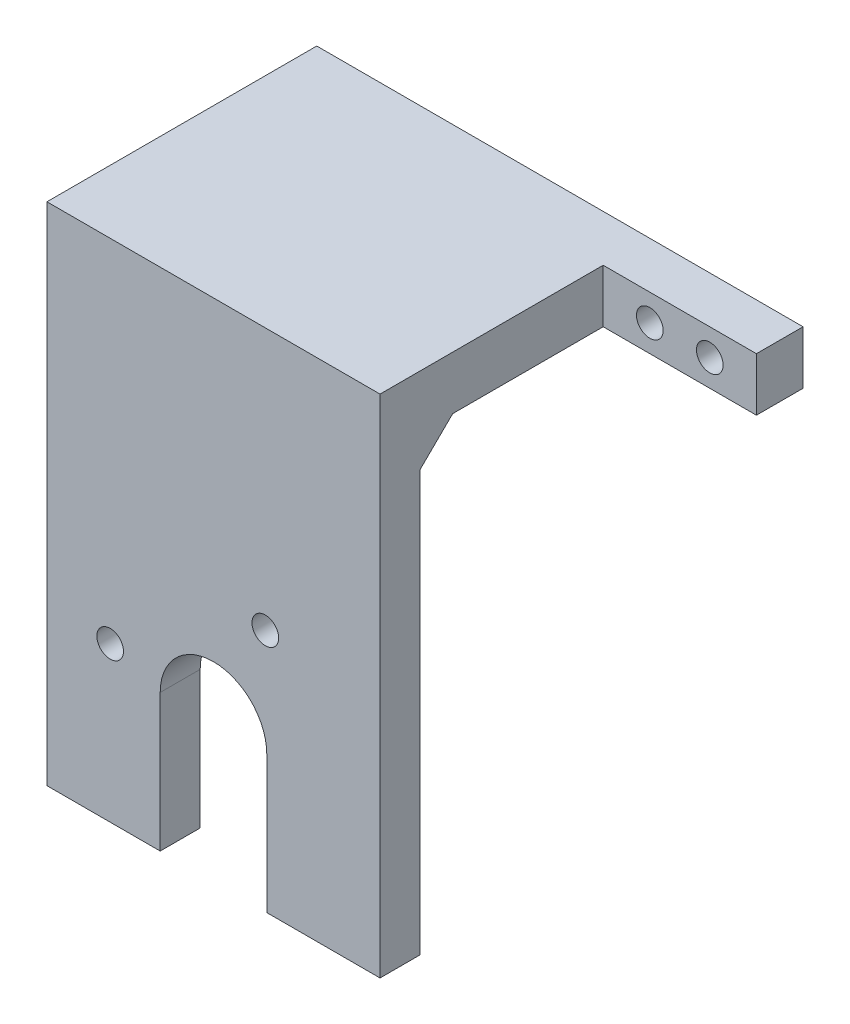
ISO-10303-21;
HEADER;
FILE_DESCRIPTION(('STEP AP214'),'2;1');
FILE_NAME('part.step','',(''),(''),'','','');
FILE_SCHEMA(('AUTOMOTIVE_DESIGN { 1 0 10303 214 1 1 1 1 }'));
ENDSEC;
DATA;
#1=APPLICATION_CONTEXT('core data for automotive mechanical design processes');
#2=APPLICATION_PROTOCOL_DEFINITION('international standard','automotive_design',2000,#1);
#3=PRODUCT_CONTEXT('',#1,'mechanical');
#4=PRODUCT('Part','Part','',(#3));
#5=PRODUCT_RELATED_PRODUCT_CATEGORY('part','',(#4));
#6=PRODUCT_DEFINITION_FORMATION('','',#4);
#7=PRODUCT_DEFINITION_CONTEXT('part definition',#1,'design');
#8=PRODUCT_DEFINITION('design','',#6,#7);
#9=PRODUCT_DEFINITION_SHAPE('','',#8);
#10=(LENGTH_UNIT() NAMED_UNIT(*) SI_UNIT(.MILLI.,.METRE.));
#11=(NAMED_UNIT(*) PLANE_ANGLE_UNIT() SI_UNIT($,.RADIAN.));
#12=(NAMED_UNIT(*) SI_UNIT($,.STERADIAN.) SOLID_ANGLE_UNIT());
#13=UNCERTAINTY_MEASURE_WITH_UNIT(LENGTH_MEASURE(1.E-05),#10,'distance_accuracy_value','');
#14=(GEOMETRIC_REPRESENTATION_CONTEXT(3) GLOBAL_UNCERTAINTY_ASSIGNED_CONTEXT((#13)) GLOBAL_UNIT_ASSIGNED_CONTEXT((#10,
#11,#12)) REPRESENTATION_CONTEXT('',''));
#15=CARTESIAN_POINT('',(0.,0.,0.));
#16=DIRECTION('',(0.,0.,1.));
#17=DIRECTION('',(1.,0.,0.));
#18=AXIS2_PLACEMENT_3D('',#15,#16,#17);
#19=CARTESIAN_POINT('',(0.,-64.9544915254237,0.));
#20=DIRECTION('',(0.,-1.,0.));
#21=DIRECTION('',(0.,0.,-1.));
#22=AXIS2_PLACEMENT_3D('',#19,#20,#21);
#23=PLANE('',#22);
#24=DIRECTION('',(0.,0.,1.));
#25=VECTOR('',#24,1.);
#26=CARTESIAN_POINT('',(-4.39406779661014,-64.9544915254237,5.5));
#27=LINE('',#26,#25);
#28=CARTESIAN_POINT('',(-4.39406779661014,-64.9544915254237,34.5));
#29=VERTEX_POINT('',#28);
#30=CARTESIAN_POINT('',(-4.39406779661014,-64.9544915254237,40.5));
#31=VERTEX_POINT('',#30);
#32=EDGE_CURVE('E41',#29,#31,#27,.T.);
#33=ORIENTED_EDGE('',*,*,#32,.F.);
#34=DIRECTION('',(1.,0.,0.));
#35=VECTOR('',#34,1.);
#36=CARTESIAN_POINT('',(-37.3940677966102,-64.9544915254237,34.5));
#37=LINE('',#36,#35);
#38=CARTESIAN_POINT('',(12.6059322033898,-64.9544915254237,34.5));
#39=VERTEX_POINT('',#38);
#40=EDGE_CURVE('E246',#29,#39,#37,.T.);
#41=ORIENTED_EDGE('',*,*,#40,.T.);
#42=DIRECTION('',(0.,0.,1.));
#43=VECTOR('',#42,1.);
#44=CARTESIAN_POINT('',(12.6059322033898,-64.9544915254237,40.5));
#45=LINE('',#44,#43);
#46=CARTESIAN_POINT('',(12.6059322033898,-64.9544915254237,40.5));
#47=VERTEX_POINT('',#46);
#48=EDGE_CURVE('E196',#39,#47,#45,.T.);
#49=ORIENTED_EDGE('',*,*,#48,.T.);
#50=DIRECTION('',(-1.,0.,0.));
#51=VECTOR('',#50,1.);
#52=CARTESIAN_POINT('',(-37.3940677966102,-64.9544915254237,40.5));
#53=LINE('',#52,#51);
#54=EDGE_CURVE('E187',#47,#31,#53,.T.);
#55=ORIENTED_EDGE('',*,*,#54,.T.);
#56=EDGE_LOOP('',(#33,#41,#49,#55));
#57=FACE_BOUND('',#56,.T.);
#58=ADVANCED_FACE('F33',(#57),#23,.T.);
#59=CARTESIAN_POINT('',(-37.3940677966102,2.95550847457627,40.5));
#60=DIRECTION('',(0.,1.,0.));
#61=DIRECTION('',(0.,0.,1.));
#62=AXIS2_PLACEMENT_3D('',#59,#60,#61);
#63=PLANE('',#62);
#64=DIRECTION('',(0.,0.,-1.));
#65=VECTOR('',#64,1.);
#66=CARTESIAN_POINT('',(-37.3940677966102,2.95550847457627,40.5));
#67=LINE('',#66,#65);
#68=CARTESIAN_POINT('',(-37.3940677966102,2.95550847457627,29.5872604999943));
#69=VERTEX_POINT('',#68);
#70=CARTESIAN_POINT('',(-37.3940677966102,2.95550847457627,0.));
#71=VERTEX_POINT('',#70);
#72=EDGE_CURVE('E124',#69,#71,#67,.T.);
#73=ORIENTED_EDGE('',*,*,#72,.T.);
#74=DIRECTION('',(-1.,0.,0.));
#75=VECTOR('',#74,1.);
#76=CARTESIAN_POINT('',(35.6059322033898,2.95550847457626,0.));
#77=LINE('',#76,#75);
#78=CARTESIAN_POINT('',(35.6059322033898,2.95550847457626,0.));
#79=VERTEX_POINT('',#78);
#80=EDGE_CURVE('E128',#79,#71,#77,.T.);
#81=ORIENTED_EDGE('',*,*,#80,.F.);
#82=DIRECTION('',(0.,0.,-1.));
#83=VECTOR('',#82,1.);
#84=CARTESIAN_POINT('',(35.6059322033898,2.95550847457626,7.));
#85=LINE('',#84,#83);
#86=CARTESIAN_POINT('',(35.6059322033898,2.95550847457626,7.));
#87=VERTEX_POINT('',#86);
#88=EDGE_CURVE('E223',#87,#79,#85,.T.);
#89=ORIENTED_EDGE('',*,*,#88,.F.);
#90=DIRECTION('',(-1.,0.,0.));
#91=VECTOR('',#90,1.);
#92=CARTESIAN_POINT('',(35.6059322033898,2.95550847457626,7.));
#93=LINE('',#92,#91);
#94=CARTESIAN_POINT('',(12.6059322033898,2.95550847457627,7.));
#95=VERTEX_POINT('',#94);
#96=EDGE_CURVE('E146',#87,#95,#93,.T.);
#97=ORIENTED_EDGE('',*,*,#96,.T.);
#98=DIRECTION('',(0.,0.,-1.));
#99=VECTOR('',#98,1.);
#100=CARTESIAN_POINT('',(12.6059322033898,2.95550847457627,40.5));
#101=LINE('',#100,#99);
#102=CARTESIAN_POINT('',(12.6059322033898,2.95550847457627,29.5872604999943));
#103=VERTEX_POINT('',#102);
#104=EDGE_CURVE('E53',#103,#95,#101,.T.);
#105=ORIENTED_EDGE('',*,*,#104,.F.);
#106=DIRECTION('',(-1.,0.,0.));
#107=VECTOR('',#106,1.);
#108=CARTESIAN_POINT('',(12.6059322033899,2.95550847457625,29.5872604999943));
#109=LINE('',#108,#107);
#110=EDGE_CURVE('E48',#103,#69,#109,.T.);
#111=ORIENTED_EDGE('',*,*,#110,.T.);
#112=EDGE_LOOP('',(#73,#81,#89,#97,#105,#111));
#113=FACE_BOUND('',#112,.T.);
#114=ADVANCED_FACE('F126',(#113),#63,.F.);
#115=CARTESIAN_POINT('',(-37.3940677966102,10.9555084745763,7.));
#116=DIRECTION('',(1.,0.,0.));
#117=DIRECTION('',(0.,1.,0.));
#118=AXIS2_PLACEMENT_3D('',#115,#116,#117);
#119=PLANE('',#118);
#120=ORIENTED_EDGE('',*,*,#72,.F.);
#121=DIRECTION('',(0.,-0.701002759097658,0.713158560025378));
#122=VECTOR('',#121,1.);
#123=CARTESIAN_POINT('',(-37.3940677966102,-1.87349328922436,34.5));
#124=LINE('',#123,#122);
#125=CARTESIAN_POINT('',(-37.3940677966102,-1.87349328922436,34.5));
#126=VERTEX_POINT('',#125);
#127=EDGE_CURVE('E141',#69,#126,#124,.T.);
#128=ORIENTED_EDGE('',*,*,#127,.T.);
#129=DIRECTION('',(0.,1.,0.));
#130=VECTOR('',#129,1.);
#131=CARTESIAN_POINT('',(-37.3940677966102,-64.9544915254237,34.5));
#132=LINE('',#131,#130);
#133=CARTESIAN_POINT('',(-37.3940677966102,-64.9544915254237,34.5));
#134=VERTEX_POINT('',#133);
#135=EDGE_CURVE('E201',#134,#126,#132,.T.);
#136=ORIENTED_EDGE('',*,*,#135,.F.);
#137=DIRECTION('',(0.,0.,-1.));
#138=VECTOR('',#137,1.);
#139=CARTESIAN_POINT('',(-37.3940677966102,-64.9544915254237,40.5));
#140=LINE('',#139,#138);
#141=CARTESIAN_POINT('',(-37.3940677966102,-64.9544915254237,40.5));
#142=VERTEX_POINT('',#141);
#143=EDGE_CURVE('E243',#142,#134,#140,.T.);
#144=ORIENTED_EDGE('',*,*,#143,.F.);
#145=DIRECTION('',(0.,-1.,0.));
#146=VECTOR('',#145,1.);
#147=CARTESIAN_POINT('',(-37.3940677966102,10.9555084745763,40.5));
#148=LINE('',#147,#146);
#149=CARTESIAN_POINT('',(-37.3940677966102,10.9555084745763,40.5));
#150=VERTEX_POINT('',#149);
#151=EDGE_CURVE('E149',#150,#142,#148,.T.);
#152=ORIENTED_EDGE('',*,*,#151,.F.);
#153=DIRECTION('',(0.,0.,-1.));
#154=VECTOR('',#153,1.);
#155=CARTESIAN_POINT('',(-37.3940677966102,10.9555084745763,7.));
#156=LINE('',#155,#154);
#157=CARTESIAN_POINT('',(-37.3940677966102,10.9555084745763,0.));
#158=VERTEX_POINT('',#157);
#159=EDGE_CURVE('E138',#150,#158,#156,.T.);
#160=ORIENTED_EDGE('',*,*,#159,.T.);
#161=DIRECTION('',(0.,1.,0.));
#162=VECTOR('',#161,1.);
#163=CARTESIAN_POINT('',(-37.3940677966102,0.,0.));
#164=LINE('',#163,#162);
#165=EDGE_CURVE('E136',#71,#158,#164,.T.);
#166=ORIENTED_EDGE('',*,*,#165,.F.);
#167=EDGE_LOOP('',(#120,#128,#136,#144,#152,#160,#166));
#168=FACE_BOUND('',#167,.T.);
#169=ADVANCED_FACE('F35',(#168),#119,.F.);
#170=CARTESIAN_POINT('',(12.6059322033898,10.9555084745763,7.));
#171=DIRECTION('',(-1.,0.,0.));
#172=DIRECTION('',(0.,-1.,0.));
#173=AXIS2_PLACEMENT_3D('',#170,#171,#172);
#174=PLANE('',#173);
#175=DIRECTION('',(0.,-0.701002759097658,0.713158560025378));
#176=VECTOR('',#175,1.);
#177=CARTESIAN_POINT('',(12.6059322033899,-1.87349328922438,34.5));
#178=LINE('',#177,#176);
#179=CARTESIAN_POINT('',(12.6059322033898,-1.87349328922437,34.5));
#180=VERTEX_POINT('',#179);
#181=EDGE_CURVE('E280',#103,#180,#178,.T.);
#182=ORIENTED_EDGE('',*,*,#181,.F.);
#183=ORIENTED_EDGE('',*,*,#104,.T.);
#184=DIRECTION('',(0.,-1.,0.));
#185=VECTOR('',#184,1.);
#186=CARTESIAN_POINT('',(12.6059322033898,2.95550847457627,7.));
#187=LINE('',#186,#185);
#188=CARTESIAN_POINT('',(12.6059322033898,10.9555084745763,7.));
#189=VERTEX_POINT('',#188);
#190=EDGE_CURVE('E219',#189,#95,#187,.T.);
#191=ORIENTED_EDGE('',*,*,#190,.F.);
#192=DIRECTION('',(0.,0.,-1.));
#193=VECTOR('',#192,1.);
#194=CARTESIAN_POINT('',(12.6059322033898,10.9555084745763,7.));
#195=LINE('',#194,#193);
#196=CARTESIAN_POINT('',(12.6059322033898,10.9555084745763,40.5));
#197=VERTEX_POINT('',#196);
#198=EDGE_CURVE('E167',#197,#189,#195,.T.);
#199=ORIENTED_EDGE('',*,*,#198,.F.);
#200=DIRECTION('',(0.,1.,0.));
#201=VECTOR('',#200,1.);
#202=CARTESIAN_POINT('',(12.6059322033898,10.9555084745763,40.5));
#203=LINE('',#202,#201);
#204=EDGE_CURVE('E158',#47,#197,#203,.T.);
#205=ORIENTED_EDGE('',*,*,#204,.F.);
#206=ORIENTED_EDGE('',*,*,#48,.F.);
#207=DIRECTION('',(0.,1.,0.));
#208=VECTOR('',#207,1.);
#209=CARTESIAN_POINT('',(12.6059322033898,-64.9544915254237,34.5));
#210=LINE('',#209,#208);
#211=EDGE_CURVE('E197',#39,#180,#210,.T.);
#212=ORIENTED_EDGE('',*,*,#211,.T.);
#213=EDGE_LOOP('',(#182,#183,#191,#199,#205,#206,#212));
#214=FACE_BOUND('',#213,.T.);
#215=ADVANCED_FACE('F234',(#214),#174,.F.);
#216=CARTESIAN_POINT('',(-37.3940677966102,10.9555084745763,7.));
#217=DIRECTION('',(0.,-1.,0.));
#218=DIRECTION('',(0.,0.,-1.));
#219=AXIS2_PLACEMENT_3D('',#216,#217,#218);
#220=PLANE('',#219);
#221=DIRECTION('',(-1.,0.,0.));
#222=VECTOR('',#221,1.);
#223=CARTESIAN_POINT('',(-37.3940677966102,10.9555084745763,0.));
#224=LINE('',#223,#222);
#225=CARTESIAN_POINT('',(35.6059322033898,10.9555084745763,0.));
#226=VERTEX_POINT('',#225);
#227=EDGE_CURVE('E133',#226,#158,#224,.T.);
#228=ORIENTED_EDGE('',*,*,#227,.T.);
#229=ORIENTED_EDGE('',*,*,#159,.F.);
#230=DIRECTION('',(-1.,0.,0.));
#231=VECTOR('',#230,1.);
#232=CARTESIAN_POINT('',(-37.3940677966102,10.9555084745763,40.5));
#233=LINE('',#232,#231);
#234=EDGE_CURVE('E161',#197,#150,#233,.T.);
#235=ORIENTED_EDGE('',*,*,#234,.F.);
#236=ORIENTED_EDGE('',*,*,#198,.T.);
#237=DIRECTION('',(-1.,0.,0.));
#238=VECTOR('',#237,1.);
#239=CARTESIAN_POINT('',(35.6059322033898,10.9555084745763,7.));
#240=LINE('',#239,#238);
#241=CARTESIAN_POINT('',(35.6059322033898,10.9555084745763,7.));
#242=VERTEX_POINT('',#241);
#243=EDGE_CURVE('E147',#242,#189,#240,.T.);
#244=ORIENTED_EDGE('',*,*,#243,.F.);
#245=DIRECTION('',(0.,0.,1.));
#246=VECTOR('',#245,1.);
#247=CARTESIAN_POINT('',(35.6059322033898,10.9555084745763,7.));
#248=LINE('',#247,#246);
#249=EDGE_CURVE('E152',#226,#242,#248,.T.);
#250=ORIENTED_EDGE('',*,*,#249,.F.);
#251=EDGE_LOOP('',(#228,#229,#235,#236,#244,#250));
#252=FACE_BOUND('',#251,.T.);
#253=ADVANCED_FACE('F237',(#252),#220,.F.);
#254=CARTESIAN_POINT('',(0.,0.,0.));
#255=DIRECTION('',(0.,0.,1.));
#256=DIRECTION('',(1.,0.,0.));
#257=AXIS2_PLACEMENT_3D('',#254,#255,#256);
#258=PLANE('',#257);
#259=CARTESIAN_POINT('',(19.6059322033898,6.95550847457627,0.));
#260=DIRECTION('',(0.,0.,1.));
#261=DIRECTION('',(1.,0.,0.));
#262=AXIS2_PLACEMENT_3D('',#259,#260,#261);
#263=CIRCLE('',#262,2.);
#264=CARTESIAN_POINT('',(21.6059322033898,6.95550847457627,0.));
#265=VERTEX_POINT('',#264);
#266=EDGE_CURVE('E216',#265,#265,#263,.T.);
#267=ORIENTED_EDGE('',*,*,#266,.T.);
#268=EDGE_LOOP('',(#267));
#269=FACE_BOUND('',#268,.T.);
#270=CARTESIAN_POINT('',(28.6059322033898,6.95550847457626,0.));
#271=DIRECTION('',(0.,0.,1.));
#272=DIRECTION('',(1.,0.,0.));
#273=AXIS2_PLACEMENT_3D('',#270,#271,#272);
#274=CIRCLE('',#273,2.);
#275=CARTESIAN_POINT('',(30.6059322033898,6.95550847457626,0.));
#276=VERTEX_POINT('',#275);
#277=EDGE_CURVE('E211',#276,#276,#274,.T.);
#278=ORIENTED_EDGE('',*,*,#277,.T.);
#279=EDGE_LOOP('',(#278));
#280=FACE_BOUND('',#279,.T.);
#281=ORIENTED_EDGE('',*,*,#80,.T.);
#282=ORIENTED_EDGE('',*,*,#165,.T.);
#283=ORIENTED_EDGE('',*,*,#227,.F.);
#284=DIRECTION('',(0.,1.,0.));
#285=VECTOR('',#284,1.);
#286=CARTESIAN_POINT('',(35.6059322033898,2.95550847457626,0.));
#287=LINE('',#286,#285);
#288=EDGE_CURVE('E145',#79,#226,#287,.T.);
#289=ORIENTED_EDGE('',*,*,#288,.F.);
#290=EDGE_LOOP('',(#281,#282,#283,#289));
#291=FACE_BOUND('',#290,.T.);
#292=ADVANCED_FACE('F143',(#269,#280,#291),#258,.F.);
#293=CARTESIAN_POINT('',(0.,0.,40.5));
#294=DIRECTION('',(0.,0.,1.));
#295=DIRECTION('',(1.,0.,0.));
#296=AXIS2_PLACEMENT_3D('',#293,#294,#295);
#297=PLANE('',#296);
#298=CARTESIAN_POINT('',(-27.9010287653283,-41.7569338906564,40.5));
#299=DIRECTION('',(0.,0.,1.));
#300=DIRECTION('',(1.,0.,0.));
#301=AXIS2_PLACEMENT_3D('',#298,#299,#300);
#302=CIRCLE('',#301,2.);
#303=CARTESIAN_POINT('',(-25.9010287653283,-41.7569338906564,40.5));
#304=VERTEX_POINT('',#303);
#305=EDGE_CURVE('E266',#304,#304,#302,.T.);
#306=ORIENTED_EDGE('',*,*,#305,.F.);
#307=EDGE_LOOP('',(#306));
#308=FACE_BOUND('',#307,.T.);
#309=CARTESIAN_POINT('',(-4.61668756949044,-28.3707157826755,40.5));
#310=DIRECTION('',(0.,0.,1.));
#311=DIRECTION('',(1.,0.,0.));
#312=AXIS2_PLACEMENT_3D('',#309,#310,#311);
#313=CIRCLE('',#312,2.);
#314=CARTESIAN_POINT('',(-2.61668756949044,-28.3707157826755,40.5));
#315=VERTEX_POINT('',#314);
#316=EDGE_CURVE('E269',#315,#315,#313,.T.);
#317=ORIENTED_EDGE('',*,*,#316,.F.);
#318=EDGE_LOOP('',(#317));
#319=FACE_BOUND('',#318,.T.);
#320=DIRECTION('',(0.,1.,0.));
#321=VECTOR('',#320,1.);
#322=CARTESIAN_POINT('',(-4.39406779661014,-44.3311558299553,40.5));
#323=LINE('',#322,#321);
#324=CARTESIAN_POINT('',(-4.39406779661014,-44.3311558299553,40.5));
#325=VERTEX_POINT('',#324);
#326=EDGE_CURVE('E177',#31,#325,#323,.T.);
#327=ORIENTED_EDGE('',*,*,#326,.F.);
#328=ORIENTED_EDGE('',*,*,#54,.F.);
#329=ORIENTED_EDGE('',*,*,#204,.T.);
#330=ORIENTED_EDGE('',*,*,#234,.T.);
#331=ORIENTED_EDGE('',*,*,#151,.T.);
#332=CARTESIAN_POINT('',(-20.3940677966102,-64.9544915254237,40.5));
#333=VERTEX_POINT('',#332);
#334=EDGE_CURVE('E198',#333,#142,#53,.T.);
#335=ORIENTED_EDGE('',*,*,#334,.F.);
#336=DIRECTION('',(0.,-1.,0.));
#337=VECTOR('',#336,1.);
#338=CARTESIAN_POINT('',(-20.3940677966101,-44.3311558299553,40.5));
#339=LINE('',#338,#337);
#340=CARTESIAN_POINT('',(-20.3940677966101,-44.3311558299553,40.5));
#341=VERTEX_POINT('',#340);
#342=EDGE_CURVE('E192',#341,#333,#339,.T.);
#343=ORIENTED_EDGE('',*,*,#342,.F.);
#344=CARTESIAN_POINT('',(-12.3940677966101,-44.3311558299553,40.5));
#345=DIRECTION('',(0.,0.,1.));
#346=DIRECTION('',(1.,0.,0.));
#347=AXIS2_PLACEMENT_3D('',#344,#345,#346);
#348=CIRCLE('',#347,8.);
#349=EDGE_CURVE('E190',#325,#341,#348,.T.);
#350=ORIENTED_EDGE('',*,*,#349,.F.);
#351=EDGE_LOOP('',(#327,#328,#329,#330,#331,#335,#343,#350));
#352=FACE_BOUND('',#351,.T.);
#353=ADVANCED_FACE('F186',(#308,#319,#352),#297,.T.);
#354=CARTESIAN_POINT('',(35.6059322033898,2.95550847457626,7.));
#355=DIRECTION('',(0.,0.,-1.));
#356=DIRECTION('',(-1.,0.,0.));
#357=AXIS2_PLACEMENT_3D('',#354,#355,#356);
#358=PLANE('',#357);
#359=CARTESIAN_POINT('',(19.6059322033898,6.95550847457627,7.));
#360=DIRECTION('',(0.,0.,1.));
#361=DIRECTION('',(1.,0.,0.));
#362=AXIS2_PLACEMENT_3D('',#359,#360,#361);
#363=CIRCLE('',#362,2.);
#364=CARTESIAN_POINT('',(21.6059322033898,6.95550847457627,7.));
#365=VERTEX_POINT('',#364);
#366=EDGE_CURVE('E208',#365,#365,#363,.T.);
#367=ORIENTED_EDGE('',*,*,#366,.F.);
#368=EDGE_LOOP('',(#367));
#369=FACE_BOUND('',#368,.T.);
#370=CARTESIAN_POINT('',(28.6059322033898,6.95550847457626,7.));
#371=DIRECTION('',(0.,0.,1.));
#372=DIRECTION('',(1.,0.,0.));
#373=AXIS2_PLACEMENT_3D('',#370,#371,#372);
#374=CIRCLE('',#373,2.);
#375=CARTESIAN_POINT('',(30.6059322033898,6.95550847457626,7.));
#376=VERTEX_POINT('',#375);
#377=EDGE_CURVE('E207',#376,#376,#374,.T.);
#378=ORIENTED_EDGE('',*,*,#377,.F.);
#379=EDGE_LOOP('',(#378));
#380=FACE_BOUND('',#379,.T.);
#381=ORIENTED_EDGE('',*,*,#190,.T.);
#382=ORIENTED_EDGE('',*,*,#96,.F.);
#383=DIRECTION('',(0.,-1.,0.));
#384=VECTOR('',#383,1.);
#385=CARTESIAN_POINT('',(35.6059322033898,2.95550847457626,7.));
#386=LINE('',#385,#384);
#387=EDGE_CURVE('E220',#242,#87,#386,.T.);
#388=ORIENTED_EDGE('',*,*,#387,.F.);
#389=ORIENTED_EDGE('',*,*,#243,.T.);
#390=EDGE_LOOP('',(#381,#382,#388,#389));
#391=FACE_BOUND('',#390,.T.);
#392=ADVANCED_FACE('F229',(#369,#380,#391),#358,.F.);
#393=CARTESIAN_POINT('',(35.6059322033898,0.,0.));
#394=DIRECTION('',(-1.,0.,0.));
#395=DIRECTION('',(0.,-1.,0.));
#396=AXIS2_PLACEMENT_3D('',#393,#394,#395);
#397=PLANE('',#396);
#398=ORIENTED_EDGE('',*,*,#387,.T.);
#399=ORIENTED_EDGE('',*,*,#88,.T.);
#400=ORIENTED_EDGE('',*,*,#288,.T.);
#401=ORIENTED_EDGE('',*,*,#249,.T.);
#402=EDGE_LOOP('',(#398,#399,#400,#401));
#403=FACE_BOUND('',#402,.T.);
#404=ADVANCED_FACE('F324',(#403),#397,.F.);
#405=CARTESIAN_POINT('',(28.6059322033898,6.95550847457626,-7.));
#406=DIRECTION('',(0.,0.,1.));
#407=DIRECTION('',(1.,0.,0.));
#408=AXIS2_PLACEMENT_3D('',#405,#406,#407);
#409=CYLINDRICAL_SURFACE('',#408,2.);
#410=ORIENTED_EDGE('',*,*,#377,.T.);
#411=EDGE_LOOP('',(#410));
#412=FACE_BOUND('',#411,.T.);
#413=ORIENTED_EDGE('',*,*,#277,.F.);
#414=EDGE_LOOP('',(#413));
#415=FACE_BOUND('',#414,.T.);
#416=ADVANCED_FACE('F316',(#412,#415),#409,.F.);
#417=CARTESIAN_POINT('',(19.6059322033898,6.95550847457627,-7.));
#418=DIRECTION('',(0.,0.,1.));
#419=DIRECTION('',(1.,0.,0.));
#420=AXIS2_PLACEMENT_3D('',#417,#418,#419);
#421=CYLINDRICAL_SURFACE('',#420,2.);
#422=ORIENTED_EDGE('',*,*,#366,.T.);
#423=EDGE_LOOP('',(#422));
#424=FACE_BOUND('',#423,.T.);
#425=ORIENTED_EDGE('',*,*,#266,.F.);
#426=EDGE_LOOP('',(#425));
#427=FACE_BOUND('',#426,.T.);
#428=ADVANCED_FACE('F311',(#424,#427),#421,.F.);
#429=CARTESIAN_POINT('',(-37.3940677966102,-64.9544915254237,34.5));
#430=DIRECTION('',(0.,0.,1.));
#431=DIRECTION('',(1.,0.,0.));
#432=AXIS2_PLACEMENT_3D('',#429,#430,#431);
#433=PLANE('',#432);
#434=CARTESIAN_POINT('',(-27.9010287653283,-41.7569338906564,34.5));
#435=DIRECTION('',(0.,0.,-1.));
#436=DIRECTION('',(-1.,0.,0.));
#437=AXIS2_PLACEMENT_3D('',#434,#435,#436);
#438=CIRCLE('',#437,2.);
#439=CARTESIAN_POINT('',(-29.9010287653283,-41.7569338906564,34.5));
#440=VERTEX_POINT('',#439);
#441=EDGE_CURVE('E272',#440,#440,#438,.T.);
#442=ORIENTED_EDGE('',*,*,#441,.F.);
#443=EDGE_LOOP('',(#442));
#444=FACE_BOUND('',#443,.T.);
#445=CARTESIAN_POINT('',(-4.61668756949044,-28.3707157826755,34.5));
#446=DIRECTION('',(0.,0.,-1.));
#447=DIRECTION('',(-1.,0.,0.));
#448=AXIS2_PLACEMENT_3D('',#445,#446,#447);
#449=CIRCLE('',#448,2.);
#450=CARTESIAN_POINT('',(-6.61668756949044,-28.3707157826755,34.5));
#451=VERTEX_POINT('',#450);
#452=EDGE_CURVE('E273',#451,#451,#449,.T.);
#453=ORIENTED_EDGE('',*,*,#452,.F.);
#454=EDGE_LOOP('',(#453));
#455=FACE_BOUND('',#454,.T.);
#456=ORIENTED_EDGE('',*,*,#135,.T.);
#457=DIRECTION('',(-1.,0.,0.));
#458=VECTOR('',#457,1.);
#459=CARTESIAN_POINT('',(12.6059322033899,-1.87349328922438,34.5));
#460=LINE('',#459,#458);
#461=EDGE_CURVE('E276',#180,#126,#460,.T.);
#462=ORIENTED_EDGE('',*,*,#461,.F.);
#463=ORIENTED_EDGE('',*,*,#211,.F.);
#464=ORIENTED_EDGE('',*,*,#40,.F.);
#465=DIRECTION('',(0.,1.,0.));
#466=VECTOR('',#465,1.);
#467=CARTESIAN_POINT('',(-4.39406779661015,-64.9544915254237,34.5));
#468=LINE('',#467,#466);
#469=CARTESIAN_POINT('',(-4.39406779661014,-44.3311558299553,34.5));
#470=VERTEX_POINT('',#469);
#471=EDGE_CURVE('E180',#29,#470,#468,.T.);
#472=ORIENTED_EDGE('',*,*,#471,.T.);
#473=CARTESIAN_POINT('',(-12.3940677966101,-44.3311558299553,34.5));
#474=DIRECTION('',(0.,0.,1.));
#475=DIRECTION('',(1.,0.,0.));
#476=AXIS2_PLACEMENT_3D('',#473,#474,#475);
#477=CIRCLE('',#476,8.);
#478=CARTESIAN_POINT('',(-20.3940677966101,-44.3311558299553,34.5));
#479=VERTEX_POINT('',#478);
#480=EDGE_CURVE('E11',#470,#479,#477,.T.);
#481=ORIENTED_EDGE('',*,*,#480,.T.);
#482=DIRECTION('',(0.,-1.,0.));
#483=VECTOR('',#482,1.);
#484=CARTESIAN_POINT('',(-20.3940677966101,-64.9544915254237,34.5));
#485=LINE('',#484,#483);
#486=CARTESIAN_POINT('',(-20.3940677966101,-64.9544915254237,34.5));
#487=VERTEX_POINT('',#486);
#488=EDGE_CURVE('E249',#479,#487,#485,.T.);
#489=ORIENTED_EDGE('',*,*,#488,.T.);
#490=EDGE_CURVE('E248',#134,#487,#37,.T.);
#491=ORIENTED_EDGE('',*,*,#490,.F.);
#492=EDGE_LOOP('',(#456,#462,#463,#464,#472,#481,#489,#491));
#493=FACE_BOUND('',#492,.T.);
#494=ADVANCED_FACE('F256',(#444,#455,#493),#433,.F.);
#495=DIRECTION('',(0.,0.,-1.));
#496=VECTOR('',#495,1.);
#497=CARTESIAN_POINT('',(-20.3940677966101,-64.9544915254237,0.));
#498=LINE('',#497,#496);
#499=EDGE_CURVE('E170',#333,#487,#498,.T.);
#500=ORIENTED_EDGE('',*,*,#499,.F.);
#501=ORIENTED_EDGE('',*,*,#334,.T.);
#502=ORIENTED_EDGE('',*,*,#143,.T.);
#503=ORIENTED_EDGE('',*,*,#490,.T.);
#504=EDGE_LOOP('',(#500,#501,#502,#503));
#505=FACE_BOUND('',#504,.T.);
#506=ADVANCED_FACE('F253',(#505),#23,.T.);
#507=CARTESIAN_POINT('',(-12.3940677966101,-44.3311558299553,5.5));
#508=DIRECTION('',(0.,0.,1.));
#509=DIRECTION('',(1.,0.,0.));
#510=AXIS2_PLACEMENT_3D('',#507,#508,#509);
#511=CYLINDRICAL_SURFACE('',#510,8.);
#512=DIRECTION('',(0.,0.,1.));
#513=VECTOR('',#512,1.);
#514=CARTESIAN_POINT('',(-4.39406779661014,-44.3311558299553,5.5));
#515=LINE('',#514,#513);
#516=EDGE_CURVE('E260',#470,#325,#515,.T.);
#517=ORIENTED_EDGE('',*,*,#516,.T.);
#518=ORIENTED_EDGE('',*,*,#349,.T.);
#519=DIRECTION('',(0.,0.,1.));
#520=VECTOR('',#519,1.);
#521=CARTESIAN_POINT('',(-20.3940677966101,-44.3311558299553,5.5));
#522=LINE('',#521,#520);
#523=EDGE_CURVE('E191',#479,#341,#522,.T.);
#524=ORIENTED_EDGE('',*,*,#523,.F.);
#525=ORIENTED_EDGE('',*,*,#480,.F.);
#526=EDGE_LOOP('',(#517,#518,#524,#525));
#527=FACE_BOUND('',#526,.T.);
#528=ADVANCED_FACE('F305',(#527),#511,.F.);
#529=CARTESIAN_POINT('',(-4.39406779661014,-44.3311558299553,5.5));
#530=DIRECTION('',(1.,0.,0.));
#531=DIRECTION('',(0.,1.,0.));
#532=AXIS2_PLACEMENT_3D('',#529,#530,#531);
#533=PLANE('',#532);
#534=ORIENTED_EDGE('',*,*,#32,.T.);
#535=ORIENTED_EDGE('',*,*,#326,.T.);
#536=ORIENTED_EDGE('',*,*,#516,.F.);
#537=ORIENTED_EDGE('',*,*,#471,.F.);
#538=EDGE_LOOP('',(#534,#535,#536,#537));
#539=FACE_BOUND('',#538,.T.);
#540=ADVANCED_FACE('F175',(#539),#533,.F.);
#541=CARTESIAN_POINT('',(-20.3940677966101,-44.3311558299553,5.5));
#542=DIRECTION('',(-1.,0.,0.));
#543=DIRECTION('',(0.,0.,1.));
#544=AXIS2_PLACEMENT_3D('',#541,#542,#543);
#545=PLANE('',#544);
#546=ORIENTED_EDGE('',*,*,#523,.T.);
#547=ORIENTED_EDGE('',*,*,#342,.T.);
#548=ORIENTED_EDGE('',*,*,#499,.T.);
#549=ORIENTED_EDGE('',*,*,#488,.F.);
#550=EDGE_LOOP('',(#546,#547,#548,#549));
#551=FACE_BOUND('',#550,.T.);
#552=ADVANCED_FACE('F383',(#551),#545,.F.);
#553=CARTESIAN_POINT('',(-4.61668756949044,-28.3707157826755,69.5));
#554=DIRECTION('',(0.,0.,-1.));
#555=DIRECTION('',(-1.,0.,0.));
#556=AXIS2_PLACEMENT_3D('',#553,#554,#555);
#557=CYLINDRICAL_SURFACE('',#556,2.);
#558=ORIENTED_EDGE('',*,*,#316,.T.);
#559=EDGE_LOOP('',(#558));
#560=FACE_BOUND('',#559,.T.);
#561=ORIENTED_EDGE('',*,*,#452,.T.);
#562=EDGE_LOOP('',(#561));
#563=FACE_BOUND('',#562,.T.);
#564=ADVANCED_FACE('F293',(#560,#563),#557,.F.);
#565=CARTESIAN_POINT('',(-27.9010287653283,-41.7569338906564,69.5));
#566=DIRECTION('',(0.,0.,-1.));
#567=DIRECTION('',(-1.,0.,0.));
#568=AXIS2_PLACEMENT_3D('',#565,#566,#567);
#569=CYLINDRICAL_SURFACE('',#568,2.);
#570=ORIENTED_EDGE('',*,*,#305,.T.);
#571=EDGE_LOOP('',(#570));
#572=FACE_BOUND('',#571,.T.);
#573=ORIENTED_EDGE('',*,*,#441,.T.);
#574=EDGE_LOOP('',(#573));
#575=FACE_BOUND('',#574,.T.);
#576=ADVANCED_FACE('F288',(#572,#575),#569,.F.);
#577=CARTESIAN_POINT('',(12.6059322033899,-1.87349328922438,34.5));
#578=DIRECTION('',(0.,-0.713158560025378,-0.701002759097658));
#579=DIRECTION('',(0.,0.701002759097658,-0.713158560025378));
#580=AXIS2_PLACEMENT_3D('',#577,#578,#579);
#581=PLANE('',#580);
#582=ORIENTED_EDGE('',*,*,#127,.F.);
#583=ORIENTED_EDGE('',*,*,#110,.F.);
#584=ORIENTED_EDGE('',*,*,#181,.T.);
#585=ORIENTED_EDGE('',*,*,#461,.T.);
#586=EDGE_LOOP('',(#582,#583,#584,#585));
#587=FACE_BOUND('',#586,.T.);
#588=ADVANCED_FACE('F285',(#587),#581,.T.);
#589=CLOSED_SHELL('',(#58,#114,#169,#215,#253,#292,#353,#392,#404,#416,#428,#494,#506,#528,#540,
#552,#564,#576,#588));
#590=MANIFOLD_SOLID_BREP('B2',#589);
#591=ADVANCED_BREP_SHAPE_REPRESENTATION('',(#18,#590),#14);
#592=SHAPE_DEFINITION_REPRESENTATION(#9,#591);
ENDSEC;
END-ISO-10303-21;
